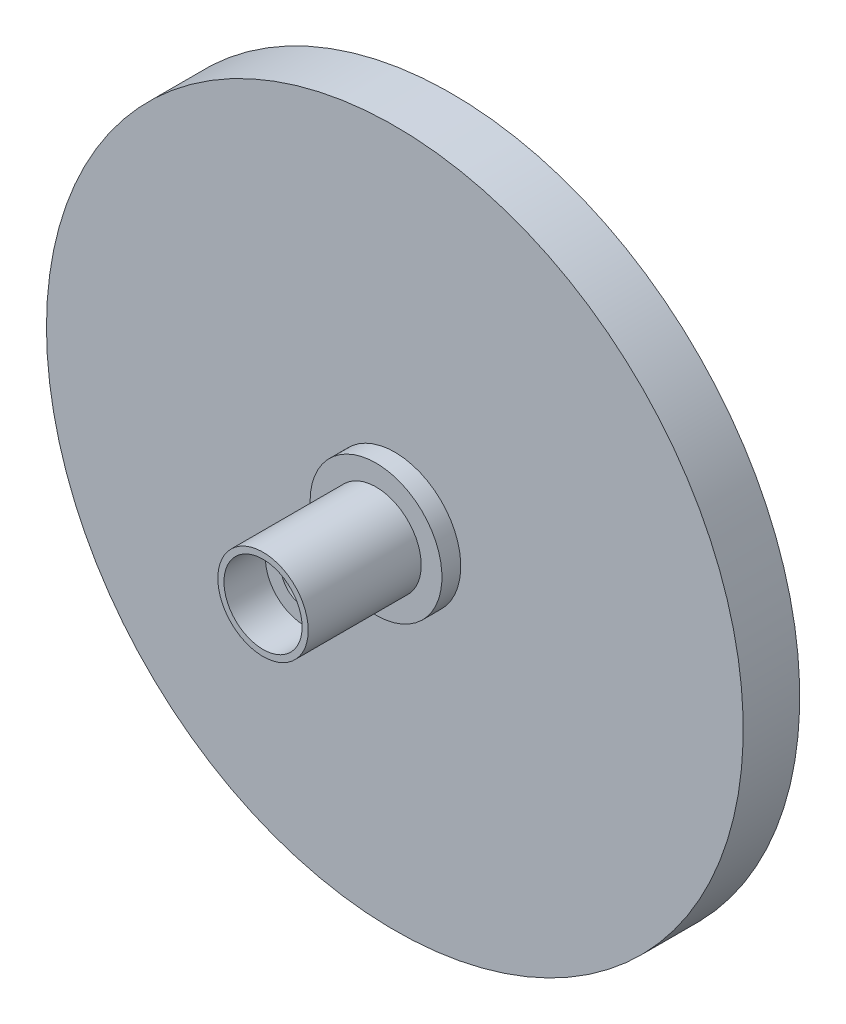
ISO-10303-21;
HEADER;
FILE_DESCRIPTION(('STEP AP214'),'2;1');
FILE_NAME('part.step','',(''),(''),'','','');
FILE_SCHEMA(('AUTOMOTIVE_DESIGN { 1 0 10303 214 1 1 1 1 }'));
ENDSEC;
DATA;
#1=APPLICATION_CONTEXT('core data for automotive mechanical design processes');
#2=APPLICATION_PROTOCOL_DEFINITION('international standard','automotive_design',2000,#1);
#3=PRODUCT_CONTEXT('',#1,'mechanical');
#4=PRODUCT('Part','Part','',(#3));
#5=PRODUCT_RELATED_PRODUCT_CATEGORY('part','',(#4));
#6=PRODUCT_DEFINITION_FORMATION('','',#4);
#7=PRODUCT_DEFINITION_CONTEXT('part definition',#1,'design');
#8=PRODUCT_DEFINITION('design','',#6,#7);
#9=PRODUCT_DEFINITION_SHAPE('','',#8);
#10=(LENGTH_UNIT() NAMED_UNIT(*) SI_UNIT(.MILLI.,.METRE.));
#11=(NAMED_UNIT(*) PLANE_ANGLE_UNIT() SI_UNIT($,.RADIAN.));
#12=(NAMED_UNIT(*) SI_UNIT($,.STERADIAN.) SOLID_ANGLE_UNIT());
#13=UNCERTAINTY_MEASURE_WITH_UNIT(LENGTH_MEASURE(1.E-05),#10,'distance_accuracy_value','');
#14=(GEOMETRIC_REPRESENTATION_CONTEXT(3) GLOBAL_UNCERTAINTY_ASSIGNED_CONTEXT((#13)) GLOBAL_UNIT_ASSIGNED_CONTEXT((#10,
#11,#12)) REPRESENTATION_CONTEXT('',''));
#15=CARTESIAN_POINT('',(0.,0.,0.));
#16=DIRECTION('',(0.,0.,1.));
#17=DIRECTION('',(1.,0.,0.));
#18=AXIS2_PLACEMENT_3D('',#15,#16,#17);
#19=CARTESIAN_POINT('',(0.,0.,6.));
#20=DIRECTION('',(0.,0.,-1.));
#21=DIRECTION('',(-1.,0.,0.));
#22=AXIS2_PLACEMENT_3D('',#19,#20,#21);
#23=CYLINDRICAL_SURFACE('',#22,2.4);
#24=CARTESIAN_POINT('',(0.,0.,6.));
#25=DIRECTION('',(0.,0.,1.));
#26=DIRECTION('',(1.,0.,0.));
#27=AXIS2_PLACEMENT_3D('',#24,#25,#26);
#28=CIRCLE('',#27,2.4);
#29=CARTESIAN_POINT('',(2.4,0.,6.));
#30=VERTEX_POINT('',#29);
#31=EDGE_CURVE('E11',#30,#30,#28,.T.);
#32=ORIENTED_EDGE('',*,*,#31,.F.);
#33=EDGE_LOOP('',(#32));
#34=FACE_BOUND('',#33,.T.);
#35=CARTESIAN_POINT('',(0.,0.,0.));
#36=DIRECTION('',(0.,0.,1.));
#37=DIRECTION('',(1.,0.,0.));
#38=AXIS2_PLACEMENT_3D('',#35,#36,#37);
#39=CIRCLE('',#38,2.4);
#40=CARTESIAN_POINT('',(2.4,0.,0.));
#41=VERTEX_POINT('',#40);
#42=EDGE_CURVE('E48',#41,#41,#39,.T.);
#43=ORIENTED_EDGE('',*,*,#42,.T.);
#44=EDGE_LOOP('',(#43));
#45=FACE_BOUND('',#44,.T.);
#46=ADVANCED_FACE('F45',(#34,#45),#23,.T.);
#47=CARTESIAN_POINT('',(0.,0.,6.));
#48=DIRECTION('',(0.,0.,1.));
#49=DIRECTION('',(1.,0.,0.));
#50=AXIS2_PLACEMENT_3D('',#47,#48,#49);
#51=PLANE('',#50);
#52=CARTESIAN_POINT('',(0.,0.,6.));
#53=DIRECTION('',(0.,0.,1.));
#54=DIRECTION('',(1.,0.,0.));
#55=AXIS2_PLACEMENT_3D('',#52,#53,#54);
#56=CIRCLE('',#55,2.075);
#57=CARTESIAN_POINT('',(2.075,0.,6.));
#58=VERTEX_POINT('',#57);
#59=EDGE_CURVE('E221',#58,#58,#56,.T.);
#60=ORIENTED_EDGE('',*,*,#59,.F.);
#61=EDGE_LOOP('',(#60));
#62=FACE_BOUND('',#61,.T.);
#63=ORIENTED_EDGE('',*,*,#31,.T.);
#64=EDGE_LOOP('',(#63));
#65=FACE_BOUND('',#64,.T.);
#66=ADVANCED_FACE('F200',(#62,#65),#51,.T.);
#67=CARTESIAN_POINT('',(0.,0.,-1.));
#68=DIRECTION('',(0.,0.,1.));
#69=DIRECTION('',(1.,0.,0.));
#70=AXIS2_PLACEMENT_3D('',#67,#68,#69);
#71=CYLINDRICAL_SURFACE('',#70,3.5);
#72=CARTESIAN_POINT('',(0.,0.,-1.));
#73=DIRECTION('',(0.,0.,-1.));
#74=DIRECTION('',(-1.,0.,0.));
#75=AXIS2_PLACEMENT_3D('',#72,#73,#74);
#76=CIRCLE('',#75,3.5);
#77=CARTESIAN_POINT('',(-3.5,0.,-1.));
#78=VERTEX_POINT('',#77);
#79=EDGE_CURVE('E178',#78,#78,#76,.T.);
#80=ORIENTED_EDGE('',*,*,#79,.F.);
#81=EDGE_LOOP('',(#80));
#82=FACE_BOUND('',#81,.T.);
#83=CARTESIAN_POINT('',(0.,0.,0.));
#84=DIRECTION('',(0.,0.,-1.));
#85=DIRECTION('',(-1.,0.,0.));
#86=AXIS2_PLACEMENT_3D('',#83,#84,#85);
#87=CIRCLE('',#86,3.5);
#88=CARTESIAN_POINT('',(-3.5,0.,0.));
#89=VERTEX_POINT('',#88);
#90=EDGE_CURVE('E174',#89,#89,#87,.T.);
#91=ORIENTED_EDGE('',*,*,#90,.T.);
#92=EDGE_LOOP('',(#91));
#93=FACE_BOUND('',#92,.T.);
#94=ADVANCED_FACE('F186',(#82,#93),#71,.T.);
#95=CARTESIAN_POINT('',(0.,0.,0.));
#96=DIRECTION('',(0.,0.,-1.));
#97=DIRECTION('',(-1.,0.,0.));
#98=AXIS2_PLACEMENT_3D('',#95,#96,#97);
#99=PLANE('',#98);
#100=ORIENTED_EDGE('',*,*,#42,.F.);
#101=EDGE_LOOP('',(#100));
#102=FACE_BOUND('',#101,.T.);
#103=ORIENTED_EDGE('',*,*,#90,.F.);
#104=EDGE_LOOP('',(#103));
#105=FACE_BOUND('',#104,.T.);
#106=ADVANCED_FACE('F188',(#102,#105),#99,.F.);
#107=CARTESIAN_POINT('',(0.,0.,-4.));
#108=DIRECTION('',(0.,0.,1.));
#109=DIRECTION('',(1.,0.,0.));
#110=AXIS2_PLACEMENT_3D('',#107,#108,#109);
#111=CYLINDRICAL_SURFACE('',#110,18.5);
#112=CARTESIAN_POINT('',(0.,0.,-4.));
#113=DIRECTION('',(0.,0.,-1.));
#114=DIRECTION('',(-1.,0.,0.));
#115=AXIS2_PLACEMENT_3D('',#112,#113,#114);
#116=CIRCLE('',#115,18.5);
#117=CARTESIAN_POINT('',(-18.5,0.,-4.));
#118=VERTEX_POINT('',#117);
#119=EDGE_CURVE('E170',#118,#118,#116,.T.);
#120=ORIENTED_EDGE('',*,*,#119,.F.);
#121=EDGE_LOOP('',(#120));
#122=FACE_BOUND('',#121,.T.);
#123=CARTESIAN_POINT('',(0.,0.,-1.));
#124=DIRECTION('',(0.,0.,-1.));
#125=DIRECTION('',(-1.,0.,0.));
#126=AXIS2_PLACEMENT_3D('',#123,#124,#125);
#127=CIRCLE('',#126,18.5);
#128=CARTESIAN_POINT('',(-18.5,0.,-1.));
#129=VERTEX_POINT('',#128);
#130=EDGE_CURVE('E160',#129,#129,#127,.T.);
#131=ORIENTED_EDGE('',*,*,#130,.T.);
#132=EDGE_LOOP('',(#131));
#133=FACE_BOUND('',#132,.T.);
#134=ADVANCED_FACE('F190',(#122,#133),#111,.T.);
#135=CARTESIAN_POINT('',(0.,0.,-4.));
#136=DIRECTION('',(0.,0.,-1.));
#137=DIRECTION('',(-1.,0.,0.));
#138=AXIS2_PLACEMENT_3D('',#135,#136,#137);
#139=PLANE('',#138);
#140=CARTESIAN_POINT('',(0.,0.,-4.));
#141=DIRECTION('',(0.,0.,1.));
#142=DIRECTION('',(1.,0.,0.));
#143=AXIS2_PLACEMENT_3D('',#140,#141,#142);
#144=CIRCLE('',#143,1.25);
#145=CARTESIAN_POINT('',(1.25,0.,-4.));
#146=VERTEX_POINT('',#145);
#147=EDGE_CURVE('E224',#146,#146,#144,.T.);
#148=ORIENTED_EDGE('',*,*,#147,.T.);
#149=EDGE_LOOP('',(#148));
#150=FACE_BOUND('',#149,.T.);
#151=DIRECTION('',(0.499999999999991,0.866025403784444,0.));
#152=VECTOR('',#151,1.);
#153=CARTESIAN_POINT('',(0.,15.3310931311878,-4.));
#154=LINE('',#153,#152);
#155=CARTESIAN_POINT('',(-1.68173019011175,12.4182509972917,-4.));
#156=VERTEX_POINT('',#155);
#157=CARTESIAN_POINT('',(0.,15.3310931311878,-4.));
#158=VERTEX_POINT('',#157);
#159=EDGE_CURVE('E60',#156,#158,#154,.T.);
#160=ORIENTED_EDGE('',*,*,#159,.F.);
#161=CARTESIAN_POINT('',(-1.50852510935484,12.3182509972918,-4.));
#162=DIRECTION('',(0.,0.,-1.));
#163=DIRECTION('',(1.,0.,0.));
#164=AXIS2_PLACEMENT_3D('',#161,#162,#163);
#165=CIRCLE('',#164,0.200000000000008);
#166=CARTESIAN_POINT('',(-1.40816744358636,12.1452529079338,-4.));
#167=VERTEX_POINT('',#166);
#168=EDGE_CURVE('E154',#167,#156,#165,.T.);
#169=ORIENTED_EDGE('',*,*,#168,.F.);
#170=CARTESIAN_POINT('',(0.00125595085952168,9.71566716111119,-4.));
#171=DIRECTION('',(0.,0.,1.));
#172=DIRECTION('',(-1.,0.,0.));
#173=AXIS2_PLACEMENT_3D('',#170,#171,#172);
#174=CIRCLE('',#173,2.8088006703885);
#175=CARTESIAN_POINT('',(0.,12.5244675507014,-4.));
#176=VERTEX_POINT('',#175);
#177=EDGE_CURVE('E151',#176,#167,#174,.T.);
#178=ORIENTED_EDGE('',*,*,#177,.F.);
#179=CARTESIAN_POINT('',(-0.00125595085952168,9.71566716111119,-4.));
#180=DIRECTION('',(0.,0.,1.));
#181=DIRECTION('',(1.,0.,0.));
#182=AXIS2_PLACEMENT_3D('',#179,#180,#181);
#183=CIRCLE('',#182,2.80880067038851);
#184=CARTESIAN_POINT('',(1.40816744358635,12.1452529079338,-4.));
#185=VERTEX_POINT('',#184);
#186=EDGE_CURVE('E108',#185,#176,#183,.T.);
#187=ORIENTED_EDGE('',*,*,#186,.F.);
#188=CARTESIAN_POINT('',(1.50852510935484,12.3182509972918,-4.));
#189=DIRECTION('',(0.,0.,-1.));
#190=DIRECTION('',(-1.,0.,0.));
#191=AXIS2_PLACEMENT_3D('',#188,#189,#190);
#192=CIRCLE('',#191,0.2);
#193=CARTESIAN_POINT('',(1.68173019011174,12.4182509972918,-4.));
#194=VERTEX_POINT('',#193);
#195=EDGE_CURVE('E145',#194,#185,#192,.T.);
#196=ORIENTED_EDGE('',*,*,#195,.F.);
#197=DIRECTION('',(0.499999999999994,-0.866025403784442,0.));
#198=VECTOR('',#197,1.);
#199=CARTESIAN_POINT('',(0.,15.3310931311878,-4.));
#200=LINE('',#199,#198);
#201=EDGE_CURVE('E140',#158,#194,#200,.T.);
#202=ORIENTED_EDGE('',*,*,#201,.F.);
#203=EDGE_LOOP('',(#160,#169,#178,#187,#196,#202));
#204=FACE_BOUND('',#203,.T.);
#205=ORIENTED_EDGE('',*,*,#119,.T.);
#206=EDGE_LOOP('',(#205));
#207=FACE_BOUND('',#206,.T.);
#208=ADVANCED_FACE('F197',(#150,#204,#207),#139,.T.);
#209=CARTESIAN_POINT('',(0.,0.,-1.));
#210=DIRECTION('',(0.,0.,-1.));
#211=DIRECTION('',(-1.,0.,0.));
#212=AXIS2_PLACEMENT_3D('',#209,#210,#211);
#213=PLANE('',#212);
#214=ORIENTED_EDGE('',*,*,#79,.T.);
#215=EDGE_LOOP('',(#214));
#216=FACE_BOUND('',#215,.T.);
#217=ORIENTED_EDGE('',*,*,#130,.F.);
#218=EDGE_LOOP('',(#217));
#219=FACE_BOUND('',#218,.T.);
#220=ADVANCED_FACE('F255',(#216,#219),#213,.F.);
#221=CARTESIAN_POINT('',(0.,15.3310931311878,-2.));
#222=DIRECTION('',(-0.866025403784444,0.499999999999991,0.));
#223=DIRECTION('',(-0.499999999999991,-0.866025403784444,0.));
#224=AXIS2_PLACEMENT_3D('',#221,#222,#223);
#225=PLANE('',#224);
#226=ORIENTED_EDGE('',*,*,#159,.T.);
#227=DIRECTION('',(0.,0.,-1.));
#228=VECTOR('',#227,1.);
#229=CARTESIAN_POINT('',(0.,15.3310931311878,-2.));
#230=LINE('',#229,#228);
#231=CARTESIAN_POINT('',(0.,15.3310931311878,-2.));
#232=VERTEX_POINT('',#231);
#233=EDGE_CURVE('E90',#232,#158,#230,.T.);
#234=ORIENTED_EDGE('',*,*,#233,.F.);
#235=DIRECTION('',(0.499999999999991,0.866025403784444,0.));
#236=VECTOR('',#235,1.);
#237=CARTESIAN_POINT('',(0.,15.3310931311878,-2.));
#238=LINE('',#237,#236);
#239=CARTESIAN_POINT('',(-1.68173019011175,12.4182509972917,-2.));
#240=VERTEX_POINT('',#239);
#241=EDGE_CURVE('E157',#240,#232,#238,.T.);
#242=ORIENTED_EDGE('',*,*,#241,.F.);
#243=DIRECTION('',(0.,0.,-1.));
#244=VECTOR('',#243,1.);
#245=CARTESIAN_POINT('',(-1.68173019011175,12.4182509972917,-2.));
#246=LINE('',#245,#244);
#247=EDGE_CURVE('E68',#240,#156,#246,.T.);
#248=ORIENTED_EDGE('',*,*,#247,.T.);
#249=EDGE_LOOP('',(#226,#234,#242,#248));
#250=FACE_BOUND('',#249,.T.);
#251=ADVANCED_FACE('F248',(#250),#225,.F.);
#252=CARTESIAN_POINT('',(-1.50852510935484,12.3182509972918,-2.));
#253=DIRECTION('',(0.,0.,-1.));
#254=DIRECTION('',(-1.,0.,0.));
#255=AXIS2_PLACEMENT_3D('',#252,#253,#254);
#256=CYLINDRICAL_SURFACE('',#255,0.200000000000008);
#257=ORIENTED_EDGE('',*,*,#168,.T.);
#258=ORIENTED_EDGE('',*,*,#247,.F.);
#259=CARTESIAN_POINT('',(-1.50852510935484,12.3182509972918,-2.));
#260=DIRECTION('',(0.,0.,-1.));
#261=DIRECTION('',(1.,0.,0.));
#262=AXIS2_PLACEMENT_3D('',#259,#260,#261);
#263=CIRCLE('',#262,0.200000000000008);
#264=CARTESIAN_POINT('',(-1.40816744358636,12.1452529079338,-2.));
#265=VERTEX_POINT('',#264);
#266=EDGE_CURVE('E122',#265,#240,#263,.T.);
#267=ORIENTED_EDGE('',*,*,#266,.F.);
#268=DIRECTION('',(0.,0.,-1.));
#269=VECTOR('',#268,1.);
#270=CARTESIAN_POINT('',(-1.40816744358636,12.1452529079338,-2.));
#271=LINE('',#270,#269);
#272=EDGE_CURVE('E113',#265,#167,#271,.T.);
#273=ORIENTED_EDGE('',*,*,#272,.T.);
#274=EDGE_LOOP('',(#257,#258,#267,#273));
#275=FACE_BOUND('',#274,.T.);
#276=ADVANCED_FACE('F246',(#275),#256,.F.);
#277=CARTESIAN_POINT('',(0.00125595085952168,9.71566716111119,-2.));
#278=DIRECTION('',(0.,0.,-1.));
#279=DIRECTION('',(-1.,0.,0.));
#280=AXIS2_PLACEMENT_3D('',#277,#278,#279);
#281=CYLINDRICAL_SURFACE('',#280,2.8088006703885);
#282=ORIENTED_EDGE('',*,*,#177,.T.);
#283=ORIENTED_EDGE('',*,*,#272,.F.);
#284=CARTESIAN_POINT('',(0.00125595085952168,9.71566716111119,-2.));
#285=DIRECTION('',(0.,0.,1.));
#286=DIRECTION('',(-1.,0.,0.));
#287=AXIS2_PLACEMENT_3D('',#284,#285,#286);
#288=CIRCLE('',#287,2.8088006703885);
#289=CARTESIAN_POINT('',(0.,12.5244675507014,-2.));
#290=VERTEX_POINT('',#289);
#291=EDGE_CURVE('E117',#290,#265,#288,.T.);
#292=ORIENTED_EDGE('',*,*,#291,.F.);
#293=DIRECTION('',(0.,0.,-1.));
#294=VECTOR('',#293,1.);
#295=CARTESIAN_POINT('',(0.,12.5244675507014,-2.));
#296=LINE('',#295,#294);
#297=EDGE_CURVE('E101',#290,#176,#296,.T.);
#298=ORIENTED_EDGE('',*,*,#297,.T.);
#299=EDGE_LOOP('',(#282,#283,#292,#298));
#300=FACE_BOUND('',#299,.T.);
#301=ADVANCED_FACE('F118',(#300),#281,.T.);
#302=CARTESIAN_POINT('',(-0.00125595085952168,9.71566716111119,-2.));
#303=DIRECTION('',(0.,0.,-1.));
#304=DIRECTION('',(-1.,0.,0.));
#305=AXIS2_PLACEMENT_3D('',#302,#303,#304);
#306=CYLINDRICAL_SURFACE('',#305,2.80880067038851);
#307=ORIENTED_EDGE('',*,*,#186,.T.);
#308=ORIENTED_EDGE('',*,*,#297,.F.);
#309=CARTESIAN_POINT('',(-0.00125595085952168,9.71566716111119,-2.));
#310=DIRECTION('',(0.,0.,1.));
#311=DIRECTION('',(1.,0.,0.));
#312=AXIS2_PLACEMENT_3D('',#309,#310,#311);
#313=CIRCLE('',#312,2.80880067038851);
#314=CARTESIAN_POINT('',(1.40816744358635,12.1452529079338,-2.));
#315=VERTEX_POINT('',#314);
#316=EDGE_CURVE('E105',#315,#290,#313,.T.);
#317=ORIENTED_EDGE('',*,*,#316,.F.);
#318=DIRECTION('',(0.,0.,-1.));
#319=VECTOR('',#318,1.);
#320=CARTESIAN_POINT('',(1.40816744358635,12.1452529079338,-2.));
#321=LINE('',#320,#319);
#322=EDGE_CURVE('E114',#315,#185,#321,.T.);
#323=ORIENTED_EDGE('',*,*,#322,.T.);
#324=EDGE_LOOP('',(#307,#308,#317,#323));
#325=FACE_BOUND('',#324,.T.);
#326=ADVANCED_FACE('F103',(#325),#306,.T.);
#327=CARTESIAN_POINT('',(1.50852510935484,12.3182509972918,-2.));
#328=DIRECTION('',(0.,0.,-1.));
#329=DIRECTION('',(-1.,0.,0.));
#330=AXIS2_PLACEMENT_3D('',#327,#328,#329);
#331=CYLINDRICAL_SURFACE('',#330,0.2);
#332=ORIENTED_EDGE('',*,*,#195,.T.);
#333=ORIENTED_EDGE('',*,*,#322,.F.);
#334=CARTESIAN_POINT('',(1.50852510935484,12.3182509972918,-2.));
#335=DIRECTION('',(0.,0.,-1.));
#336=DIRECTION('',(-1.,0.,0.));
#337=AXIS2_PLACEMENT_3D('',#334,#335,#336);
#338=CIRCLE('',#337,0.2);
#339=CARTESIAN_POINT('',(1.68173019011174,12.4182509972918,-2.));
#340=VERTEX_POINT('',#339);
#341=EDGE_CURVE('E128',#340,#315,#338,.T.);
#342=ORIENTED_EDGE('',*,*,#341,.F.);
#343=DIRECTION('',(0.,0.,-1.));
#344=VECTOR('',#343,1.);
#345=CARTESIAN_POINT('',(1.68173019011174,12.4182509972918,-2.));
#346=LINE('',#345,#344);
#347=EDGE_CURVE('E165',#340,#194,#346,.T.);
#348=ORIENTED_EDGE('',*,*,#347,.T.);
#349=EDGE_LOOP('',(#332,#333,#342,#348));
#350=FACE_BOUND('',#349,.T.);
#351=ADVANCED_FACE('F242',(#350),#331,.F.);
#352=CARTESIAN_POINT('',(0.,15.3310931311878,-2.));
#353=DIRECTION('',(0.866025403784442,0.499999999999994,0.));
#354=DIRECTION('',(-0.499999999999994,0.866025403784442,0.));
#355=AXIS2_PLACEMENT_3D('',#352,#353,#354);
#356=PLANE('',#355);
#357=ORIENTED_EDGE('',*,*,#201,.T.);
#358=ORIENTED_EDGE('',*,*,#347,.F.);
#359=DIRECTION('',(0.499999999999994,-0.866025403784442,0.));
#360=VECTOR('',#359,1.);
#361=CARTESIAN_POINT('',(0.,15.3310931311878,-2.));
#362=LINE('',#361,#360);
#363=EDGE_CURVE('E132',#232,#340,#362,.T.);
#364=ORIENTED_EDGE('',*,*,#363,.F.);
#365=ORIENTED_EDGE('',*,*,#233,.T.);
#366=EDGE_LOOP('',(#357,#358,#364,#365));
#367=FACE_BOUND('',#366,.T.);
#368=ADVANCED_FACE('F238',(#367),#356,.F.);
#369=CARTESIAN_POINT('',(-1.50852510935484,12.3182509972918,-2.));
#370=DIRECTION('',(0.,0.,1.));
#371=DIRECTION('',(1.,0.,0.));
#372=AXIS2_PLACEMENT_3D('',#369,#370,#371);
#373=PLANE('',#372);
#374=ORIENTED_EDGE('',*,*,#241,.T.);
#375=ORIENTED_EDGE('',*,*,#363,.T.);
#376=ORIENTED_EDGE('',*,*,#341,.T.);
#377=ORIENTED_EDGE('',*,*,#316,.T.);
#378=ORIENTED_EDGE('',*,*,#291,.T.);
#379=ORIENTED_EDGE('',*,*,#266,.T.);
#380=EDGE_LOOP('',(#374,#375,#376,#377,#378,#379));
#381=FACE_BOUND('',#380,.T.);
#382=ADVANCED_FACE('F125',(#381),#373,.F.);
#383=CARTESIAN_POINT('',(0.,0.,3.8));
#384=DIRECTION('',(0.,0.,1.));
#385=DIRECTION('',(1.,0.,0.));
#386=AXIS2_PLACEMENT_3D('',#383,#384,#385);
#387=CYLINDRICAL_SURFACE('',#386,2.075);
#388=CARTESIAN_POINT('',(0.,0.,3.8));
#389=DIRECTION('',(0.,0.,1.));
#390=DIRECTION('',(1.,0.,0.));
#391=AXIS2_PLACEMENT_3D('',#388,#389,#390);
#392=CIRCLE('',#391,2.075);
#393=CARTESIAN_POINT('',(2.075,0.,3.8));
#394=VERTEX_POINT('',#393);
#395=EDGE_CURVE('E141',#394,#394,#392,.T.);
#396=ORIENTED_EDGE('',*,*,#395,.F.);
#397=EDGE_LOOP('',(#396));
#398=FACE_BOUND('',#397,.T.);
#399=ORIENTED_EDGE('',*,*,#59,.T.);
#400=EDGE_LOOP('',(#399));
#401=FACE_BOUND('',#400,.T.);
#402=ADVANCED_FACE('F322',(#398,#401),#387,.F.);
#403=CARTESIAN_POINT('',(0.,0.,3.8));
#404=DIRECTION('',(0.,0.,1.));
#405=DIRECTION('',(1.,0.,0.));
#406=AXIS2_PLACEMENT_3D('',#403,#404,#405);
#407=PLANE('',#406);
#408=CARTESIAN_POINT('',(0.,0.,3.8));
#409=DIRECTION('',(0.,0.,1.));
#410=DIRECTION('',(1.,0.,0.));
#411=AXIS2_PLACEMENT_3D('',#408,#409,#410);
#412=CIRCLE('',#411,1.25);
#413=CARTESIAN_POINT('',(1.25,0.,3.8));
#414=VERTEX_POINT('',#413);
#415=EDGE_CURVE('E231',#414,#414,#412,.T.);
#416=ORIENTED_EDGE('',*,*,#415,.F.);
#417=EDGE_LOOP('',(#416));
#418=FACE_BOUND('',#417,.T.);
#419=ORIENTED_EDGE('',*,*,#395,.T.);
#420=EDGE_LOOP('',(#419));
#421=FACE_BOUND('',#420,.T.);
#422=ADVANCED_FACE('F329',(#418,#421),#407,.T.);
#423=CARTESIAN_POINT('',(0.,0.,-4.));
#424=DIRECTION('',(0.,0.,1.));
#425=DIRECTION('',(1.,0.,0.));
#426=AXIS2_PLACEMENT_3D('',#423,#424,#425);
#427=CYLINDRICAL_SURFACE('',#426,1.25);
#428=ORIENTED_EDGE('',*,*,#147,.F.);
#429=EDGE_LOOP('',(#428));
#430=FACE_BOUND('',#429,.T.);
#431=ORIENTED_EDGE('',*,*,#415,.T.);
#432=EDGE_LOOP('',(#431));
#433=FACE_BOUND('',#432,.T.);
#434=ADVANCED_FACE('F338',(#430,#433),#427,.F.);
#435=CLOSED_SHELL('',(#46,#66,#94,#106,#134,#208,#220,#251,#276,#301,#326,#351,#368,#382,#402,
#422,#434));
#436=MANIFOLD_SOLID_BREP('B2',#435);
#437=ADVANCED_BREP_SHAPE_REPRESENTATION('',(#18,#436),#14);
#438=SHAPE_DEFINITION_REPRESENTATION(#9,#437);
ENDSEC;
END-ISO-10303-21;
